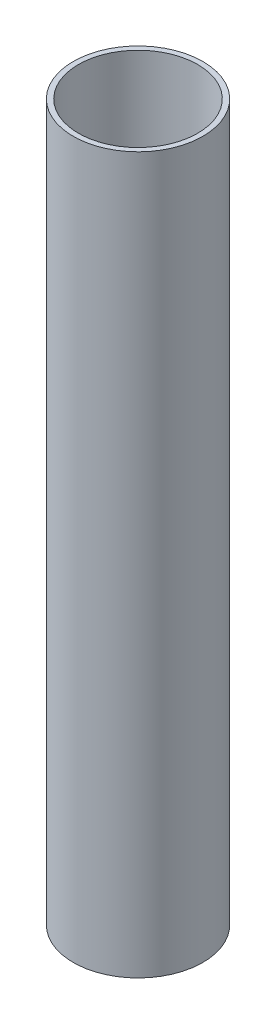
ISO-10303-21;
HEADER;
FILE_DESCRIPTION(('STEP AP214'),'2;1');
FILE_NAME('part.step','',(''),(''),'','','');
FILE_SCHEMA(('AUTOMOTIVE_DESIGN { 1 0 10303 214 1 1 1 1 }'));
ENDSEC;
DATA;
#1=APPLICATION_CONTEXT('core data for automotive mechanical design processes');
#2=APPLICATION_PROTOCOL_DEFINITION('international standard','automotive_design',2000,#1);
#3=PRODUCT_CONTEXT('',#1,'mechanical');
#4=PRODUCT('Part','Part','',(#3));
#5=PRODUCT_RELATED_PRODUCT_CATEGORY('part','',(#4));
#6=PRODUCT_DEFINITION_FORMATION('','',#4);
#7=PRODUCT_DEFINITION_CONTEXT('part definition',#1,'design');
#8=PRODUCT_DEFINITION('design','',#6,#7);
#9=PRODUCT_DEFINITION_SHAPE('','',#8);
#10=(LENGTH_UNIT() NAMED_UNIT(*) SI_UNIT(.MILLI.,.METRE.));
#11=(NAMED_UNIT(*) PLANE_ANGLE_UNIT() SI_UNIT($,.RADIAN.));
#12=(NAMED_UNIT(*) SI_UNIT($,.STERADIAN.) SOLID_ANGLE_UNIT());
#13=UNCERTAINTY_MEASURE_WITH_UNIT(LENGTH_MEASURE(1.E-05),#10,'distance_accuracy_value','');
#14=(GEOMETRIC_REPRESENTATION_CONTEXT(3) GLOBAL_UNCERTAINTY_ASSIGNED_CONTEXT((#13)) GLOBAL_UNIT_ASSIGNED_CONTEXT((#10,
#11,#12)) REPRESENTATION_CONTEXT('',''));
#15=CARTESIAN_POINT('',(0.,0.,0.));
#16=DIRECTION('',(0.,0.,1.));
#17=DIRECTION('',(1.,0.,0.));
#18=AXIS2_PLACEMENT_3D('',#15,#16,#17);
#19=CARTESIAN_POINT('',(0.,304.8,0.));
#20=DIRECTION('',(0.,1.,0.));
#21=DIRECTION('',(0.,0.,1.));
#22=AXIS2_PLACEMENT_3D('',#19,#20,#21);
#23=PLANE('',#22);
#24=CARTESIAN_POINT('',(0.,304.8,0.));
#25=DIRECTION('',(0.,1.,0.));
#26=DIRECTION('',(0.,0.,1.));
#27=AXIS2_PLACEMENT_3D('',#24,#25,#26);
#28=CIRCLE('',#27,27.6225);
#29=CARTESIAN_POINT('',(0.,304.8,-27.6225));
#30=VERTEX_POINT('',#29);
#31=EDGE_CURVE('E10',#30,#30,#28,.T.);
#32=ORIENTED_EDGE('',*,*,#31,.T.);
#33=EDGE_LOOP('',(#32));
#34=FACE_BOUND('',#33,.T.);
#35=CARTESIAN_POINT('',(0.,304.8,0.));
#36=DIRECTION('',(0.,1.,0.));
#37=DIRECTION('',(0.,0.,1.));
#38=AXIS2_PLACEMENT_3D('',#35,#36,#37);
#39=CIRCLE('',#38,25.4);
#40=CARTESIAN_POINT('',(0.,304.8,-25.4));
#41=VERTEX_POINT('',#40);
#42=EDGE_CURVE('E54',#41,#41,#39,.T.);
#43=ORIENTED_EDGE('',*,*,#42,.F.);
#44=EDGE_LOOP('',(#43));
#45=FACE_BOUND('',#44,.T.);
#46=ADVANCED_FACE('F43',(#34,#45),#23,.T.);
#47=CARTESIAN_POINT('',(0.,0.,0.));
#48=DIRECTION('',(0.,1.,0.));
#49=DIRECTION('',(0.,0.,1.));
#50=AXIS2_PLACEMENT_3D('',#47,#48,#49);
#51=PLANE('',#50);
#52=CARTESIAN_POINT('',(0.,0.,0.));
#53=DIRECTION('',(0.,1.,0.));
#54=DIRECTION('',(0.,0.,1.));
#55=AXIS2_PLACEMENT_3D('',#52,#53,#54);
#56=CIRCLE('',#55,27.6225);
#57=CARTESIAN_POINT('',(0.,0.,-27.6225));
#58=VERTEX_POINT('',#57);
#59=EDGE_CURVE('E47',#58,#58,#56,.T.);
#60=ORIENTED_EDGE('',*,*,#59,.F.);
#61=EDGE_LOOP('',(#60));
#62=FACE_BOUND('',#61,.T.);
#63=CARTESIAN_POINT('',(0.,0.,0.));
#64=DIRECTION('',(0.,1.,0.));
#65=DIRECTION('',(0.,0.,1.));
#66=AXIS2_PLACEMENT_3D('',#63,#64,#65);
#67=CIRCLE('',#66,25.4);
#68=CARTESIAN_POINT('',(0.,0.,-25.4));
#69=VERTEX_POINT('',#68);
#70=EDGE_CURVE('E56',#69,#69,#67,.T.);
#71=ORIENTED_EDGE('',*,*,#70,.T.);
#72=EDGE_LOOP('',(#71));
#73=FACE_BOUND('',#72,.T.);
#74=ADVANCED_FACE('F66',(#62,#73),#51,.F.);
#75=CARTESIAN_POINT('',(0.,304.8,0.));
#76=DIRECTION('',(0.,-1.,0.));
#77=DIRECTION('',(0.,0.,-1.));
#78=AXIS2_PLACEMENT_3D('',#75,#76,#77);
#79=CYLINDRICAL_SURFACE('',#78,27.6225);
#80=CARTESIAN_POINT('',(0.,304.8,-27.6225));
#81=CARTESIAN_POINT('',(0.,301.625,-27.6225));
#82=CARTESIAN_POINT('',(0.,298.45,-27.6225));
#83=CARTESIAN_POINT('',(0.,292.1,-27.6225));
#84=CARTESIAN_POINT('',(0.,288.925,-27.6225));
#85=CARTESIAN_POINT('',(0.,282.575,-27.6225));
#86=CARTESIAN_POINT('',(0.,279.4,-27.6225));
#87=CARTESIAN_POINT('',(0.,273.05,-27.6225));
#88=CARTESIAN_POINT('',(0.,269.875,-27.6225));
#89=CARTESIAN_POINT('',(0.,263.525,-27.6225));
#90=CARTESIAN_POINT('',(0.,260.35,-27.6225));
#91=CARTESIAN_POINT('',(0.,254.,-27.6225));
#92=CARTESIAN_POINT('',(0.,250.825,-27.6225));
#93=CARTESIAN_POINT('',(0.,244.475,-27.6225));
#94=CARTESIAN_POINT('',(0.,241.3,-27.6225));
#95=CARTESIAN_POINT('',(0.,234.95,-27.6225));
#96=CARTESIAN_POINT('',(0.,231.775,-27.6225));
#97=CARTESIAN_POINT('',(0.,225.425,-27.6225));
#98=CARTESIAN_POINT('',(0.,222.25,-27.6225));
#99=CARTESIAN_POINT('',(0.,215.9,-27.6225));
#100=CARTESIAN_POINT('',(0.,212.725,-27.6225));
#101=CARTESIAN_POINT('',(0.,206.375,-27.6225));
#102=CARTESIAN_POINT('',(0.,203.2,-27.6225));
#103=CARTESIAN_POINT('',(0.,196.85,-27.6225));
#104=CARTESIAN_POINT('',(0.,193.675,-27.6225));
#105=CARTESIAN_POINT('',(0.,187.325,-27.6225));
#106=CARTESIAN_POINT('',(0.,184.15,-27.6225));
#107=CARTESIAN_POINT('',(0.,177.8,-27.6225));
#108=CARTESIAN_POINT('',(0.,174.625,-27.6225));
#109=CARTESIAN_POINT('',(0.,168.275,-27.6225));
#110=CARTESIAN_POINT('',(0.,165.1,-27.6225));
#111=CARTESIAN_POINT('',(0.,158.75,-27.6225));
#112=CARTESIAN_POINT('',(0.,155.575,-27.6225));
#113=CARTESIAN_POINT('',(0.,149.225,-27.6225));
#114=CARTESIAN_POINT('',(0.,146.05,-27.6225));
#115=CARTESIAN_POINT('',(0.,139.7,-27.6225));
#116=CARTESIAN_POINT('',(0.,136.525,-27.6225));
#117=CARTESIAN_POINT('',(0.,130.175,-27.6225));
#118=CARTESIAN_POINT('',(0.,127.,-27.6225));
#119=CARTESIAN_POINT('',(0.,120.65,-27.6225));
#120=CARTESIAN_POINT('',(0.,117.475,-27.6225));
#121=CARTESIAN_POINT('',(0.,111.125,-27.6225));
#122=CARTESIAN_POINT('',(0.,107.95,-27.6225));
#123=CARTESIAN_POINT('',(0.,101.6,-27.6225));
#124=CARTESIAN_POINT('',(0.,98.425,-27.6225));
#125=CARTESIAN_POINT('',(0.,92.075,-27.6225));
#126=CARTESIAN_POINT('',(0.,88.9,-27.6225));
#127=CARTESIAN_POINT('',(0.,82.55,-27.6225));
#128=CARTESIAN_POINT('',(0.,79.375,-27.6225));
#129=CARTESIAN_POINT('',(0.,73.025,-27.6225));
#130=CARTESIAN_POINT('',(0.,69.85,-27.6225));
#131=CARTESIAN_POINT('',(0.,63.5,-27.6225));
#132=CARTESIAN_POINT('',(0.,60.325,-27.6225));
#133=CARTESIAN_POINT('',(0.,53.975,-27.6225));
#134=CARTESIAN_POINT('',(0.,50.8,-27.6225));
#135=CARTESIAN_POINT('',(0.,44.45,-27.6225));
#136=CARTESIAN_POINT('',(0.,41.275,-27.6225));
#137=CARTESIAN_POINT('',(0.,34.925,-27.6225));
#138=CARTESIAN_POINT('',(0.,31.75,-27.6225));
#139=CARTESIAN_POINT('',(0.,25.4,-27.6225));
#140=CARTESIAN_POINT('',(0.,22.225,-27.6225));
#141=CARTESIAN_POINT('',(0.,15.875,-27.6225));
#142=CARTESIAN_POINT('',(0.,12.7,-27.6225));
#143=CARTESIAN_POINT('',(0.,6.35,-27.6225));
#144=CARTESIAN_POINT('',(0.,3.175,-27.6225));
#145=CARTESIAN_POINT('',(0.,0.,-27.6225));
#146=B_SPLINE_CURVE_WITH_KNOTS('',3,(#80,#81,#82,#83,#84,#85,#86,#87,#88,#89,#90,#91,#92,#93,
#94,#95,#96,#97,#98,#99,#100,#101,#102,#103,#104,#105,#106,#107,#108,#109,#110,#111,#112,#113,
#114,#115,#116,#117,#118,#119,#120,#121,#122,#123,#124,#125,#126,#127,#128,#129,#130,#131,#132,
#133,#134,#135,#136,#137,#138,#139,#140,#141,#142,#143,#144,#145),.UNSPECIFIED.,.F.,.F.,(4,2,2,
2,2,2,2,2,2,2,2,2,2,2,2,2,2,2,2,2,2,2,2,2,2,2,2,2,2,2,2,2,4),(0.,9.52499999999995,19.05,28.575,
38.1,47.625,57.15,66.675,76.2,85.725,95.2499999999999,104.775,114.3,123.825,133.35,142.875,
152.4,161.925,171.45,180.975,190.5,200.025,209.55,219.075,228.6,238.125,247.65,257.175,266.7,
276.225,285.75,295.275,304.8),.UNSPECIFIED.);
#147=EDGE_CURVE('BSEAM45',#30,#58,#146,.T.);
#148=ORIENTED_EDGE('',*,*,#31,.F.);
#149=ORIENTED_EDGE('',*,*,#59,.T.);
#150=ORIENTED_EDGE('',*,*,#147,.T.);
#151=ORIENTED_EDGE('',*,*,#147,.F.);
#152=EDGE_LOOP('',(#148,#150,#149,#151));
#153=FACE_BOUND('',#152,.T.);
#154=ADVANCED_FACE('F45',(#153),#79,.T.);
#155=CARTESIAN_POINT('',(0.,304.8,0.));
#156=DIRECTION('',(0.,-1.,0.));
#157=DIRECTION('',(0.,0.,-1.));
#158=AXIS2_PLACEMENT_3D('',#155,#156,#157);
#159=CYLINDRICAL_SURFACE('',#158,25.4);
#160=CARTESIAN_POINT('',(0.,304.8,-25.4));
#161=CARTESIAN_POINT('',(0.,301.625,-25.4));
#162=CARTESIAN_POINT('',(0.,298.45,-25.4));
#163=CARTESIAN_POINT('',(0.,292.1,-25.4));
#164=CARTESIAN_POINT('',(0.,288.925,-25.4));
#165=CARTESIAN_POINT('',(0.,282.575,-25.4));
#166=CARTESIAN_POINT('',(0.,279.4,-25.4));
#167=CARTESIAN_POINT('',(0.,273.05,-25.4));
#168=CARTESIAN_POINT('',(0.,269.875,-25.4));
#169=CARTESIAN_POINT('',(0.,263.525,-25.4));
#170=CARTESIAN_POINT('',(0.,260.35,-25.4));
#171=CARTESIAN_POINT('',(0.,254.,-25.4));
#172=CARTESIAN_POINT('',(0.,250.825,-25.4));
#173=CARTESIAN_POINT('',(0.,244.475,-25.4));
#174=CARTESIAN_POINT('',(0.,241.3,-25.4));
#175=CARTESIAN_POINT('',(0.,234.95,-25.4));
#176=CARTESIAN_POINT('',(0.,231.775,-25.4));
#177=CARTESIAN_POINT('',(0.,225.425,-25.4));
#178=CARTESIAN_POINT('',(0.,222.25,-25.4));
#179=CARTESIAN_POINT('',(0.,215.9,-25.4));
#180=CARTESIAN_POINT('',(0.,212.725,-25.4));
#181=CARTESIAN_POINT('',(0.,206.375,-25.4));
#182=CARTESIAN_POINT('',(0.,203.2,-25.4));
#183=CARTESIAN_POINT('',(0.,196.85,-25.4));
#184=CARTESIAN_POINT('',(0.,193.675,-25.4));
#185=CARTESIAN_POINT('',(0.,187.325,-25.4));
#186=CARTESIAN_POINT('',(0.,184.15,-25.4));
#187=CARTESIAN_POINT('',(0.,177.8,-25.4));
#188=CARTESIAN_POINT('',(0.,174.625,-25.4));
#189=CARTESIAN_POINT('',(0.,168.275,-25.4));
#190=CARTESIAN_POINT('',(0.,165.1,-25.4));
#191=CARTESIAN_POINT('',(0.,158.75,-25.4));
#192=CARTESIAN_POINT('',(0.,155.575,-25.4));
#193=CARTESIAN_POINT('',(0.,149.225,-25.4));
#194=CARTESIAN_POINT('',(0.,146.05,-25.4));
#195=CARTESIAN_POINT('',(0.,139.7,-25.4));
#196=CARTESIAN_POINT('',(0.,136.525,-25.4));
#197=CARTESIAN_POINT('',(0.,130.175,-25.4));
#198=CARTESIAN_POINT('',(0.,127.,-25.4));
#199=CARTESIAN_POINT('',(0.,120.65,-25.4));
#200=CARTESIAN_POINT('',(0.,117.475,-25.4));
#201=CARTESIAN_POINT('',(0.,111.125,-25.4));
#202=CARTESIAN_POINT('',(0.,107.95,-25.4));
#203=CARTESIAN_POINT('',(0.,101.6,-25.4));
#204=CARTESIAN_POINT('',(0.,98.425,-25.4));
#205=CARTESIAN_POINT('',(0.,92.075,-25.4));
#206=CARTESIAN_POINT('',(0.,88.9,-25.4));
#207=CARTESIAN_POINT('',(0.,82.55,-25.4));
#208=CARTESIAN_POINT('',(0.,79.375,-25.4));
#209=CARTESIAN_POINT('',(0.,73.025,-25.4));
#210=CARTESIAN_POINT('',(0.,69.85,-25.4));
#211=CARTESIAN_POINT('',(0.,63.5,-25.4));
#212=CARTESIAN_POINT('',(0.,60.325,-25.4));
#213=CARTESIAN_POINT('',(0.,53.975,-25.4));
#214=CARTESIAN_POINT('',(0.,50.8,-25.4));
#215=CARTESIAN_POINT('',(0.,44.45,-25.4));
#216=CARTESIAN_POINT('',(0.,41.275,-25.4));
#217=CARTESIAN_POINT('',(0.,34.925,-25.4));
#218=CARTESIAN_POINT('',(0.,31.75,-25.4));
#219=CARTESIAN_POINT('',(0.,25.4,-25.4));
#220=CARTESIAN_POINT('',(0.,22.225,-25.4));
#221=CARTESIAN_POINT('',(0.,15.875,-25.4));
#222=CARTESIAN_POINT('',(0.,12.7,-25.4));
#223=CARTESIAN_POINT('',(0.,6.35,-25.4));
#224=CARTESIAN_POINT('',(0.,3.175,-25.4));
#225=CARTESIAN_POINT('',(0.,0.,-25.4));
#226=B_SPLINE_CURVE_WITH_KNOTS('',3,(#160,#161,#162,#163,#164,#165,#166,#167,#168,#169,#170,
#171,#172,#173,#174,#175,#176,#177,#178,#179,#180,#181,#182,#183,#184,#185,#186,#187,#188,#189,
#190,#191,#192,#193,#194,#195,#196,#197,#198,#199,#200,#201,#202,#203,#204,#205,#206,#207,#208,
#209,#210,#211,#212,#213,#214,#215,#216,#217,#218,#219,#220,#221,#222,#223,#224,#225),
.UNSPECIFIED.,.F.,.F.,(4,2,2,2,2,2,2,2,2,2,2,2,2,2,2,2,2,2,2,2,2,2,2,2,2,2,2,2,2,2,2,2,4),(0.,
9.52499999999995,19.05,28.575,38.1,47.625,57.15,66.675,76.2,85.725,95.2499999999999,104.775,
114.3,123.825,133.35,142.875,152.4,161.925,171.45,180.975,190.5,200.025,209.55,219.075,228.6,
238.125,247.65,257.175,266.7,276.225,285.75,295.275,304.8),.UNSPECIFIED.);
#227=EDGE_CURVE('BSEAM62',#41,#69,#226,.T.);
#228=ORIENTED_EDGE('',*,*,#42,.T.);
#229=ORIENTED_EDGE('',*,*,#70,.F.);
#230=ORIENTED_EDGE('',*,*,#227,.T.);
#231=ORIENTED_EDGE('',*,*,#227,.F.);
#232=EDGE_LOOP('',(#228,#230,#229,#231));
#233=FACE_BOUND('',#232,.T.);
#234=ADVANCED_FACE('F62',(#233),#159,.F.);
#235=CLOSED_SHELL('',(#46,#74,#154,#234));
#236=MANIFOLD_SOLID_BREP('B2',#235);
#237=ADVANCED_BREP_SHAPE_REPRESENTATION('',(#18,#236),#14);
#238=SHAPE_DEFINITION_REPRESENTATION(#9,#237);
ENDSEC;
END-ISO-10303-21;
